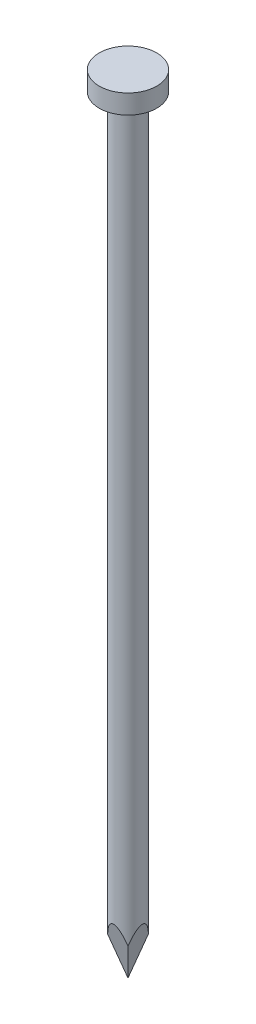
ISO-10303-21;
HEADER;
FILE_DESCRIPTION(('STEP AP214'),'2;1');
FILE_NAME('part.step','',(''),(''),'','','');
FILE_SCHEMA(('AUTOMOTIVE_DESIGN { 1 0 10303 214 1 1 1 1 }'));
ENDSEC;
DATA;
#1=APPLICATION_CONTEXT('core data for automotive mechanical design processes');
#2=APPLICATION_PROTOCOL_DEFINITION('international standard','automotive_design',2000,#1);
#3=PRODUCT_CONTEXT('',#1,'mechanical');
#4=PRODUCT('Part','Part','',(#3));
#5=PRODUCT_RELATED_PRODUCT_CATEGORY('part','',(#4));
#6=PRODUCT_DEFINITION_FORMATION('','',#4);
#7=PRODUCT_DEFINITION_CONTEXT('part definition',#1,'design');
#8=PRODUCT_DEFINITION('design','',#6,#7);
#9=PRODUCT_DEFINITION_SHAPE('','',#8);
#10=(LENGTH_UNIT() NAMED_UNIT(*) SI_UNIT(.MILLI.,.METRE.));
#11=(NAMED_UNIT(*) PLANE_ANGLE_UNIT() SI_UNIT($,.RADIAN.));
#12=(NAMED_UNIT(*) SI_UNIT($,.STERADIAN.) SOLID_ANGLE_UNIT());
#13=UNCERTAINTY_MEASURE_WITH_UNIT(LENGTH_MEASURE(1.E-05),#10,'distance_accuracy_value','');
#14=(GEOMETRIC_REPRESENTATION_CONTEXT(3) GLOBAL_UNCERTAINTY_ASSIGNED_CONTEXT((#13)) GLOBAL_UNIT_ASSIGNED_CONTEXT((#10,
#11,#12)) REPRESENTATION_CONTEXT('',''));
#15=CARTESIAN_POINT('',(0.,0.,0.));
#16=DIRECTION('',(0.,0.,1.));
#17=DIRECTION('',(1.,0.,0.));
#18=AXIS2_PLACEMENT_3D('',#15,#16,#17);
#19=CARTESIAN_POINT('',(0.,-40.,0.));
#20=DIRECTION('',(0.,1.,0.));
#21=DIRECTION('',(0.,0.,1.));
#22=AXIS2_PLACEMENT_3D('',#19,#20,#21);
#23=CYLINDRICAL_SURFACE('',#22,0.750000000000001);
#24=CARTESIAN_POINT('',(0.,-40.,0.));
#25=DIRECTION('',(0.965925826289067,0.258819045102525,0.));
#26=DIRECTION('',(-0.258819045102525,0.965925826289067,0.));
#27=AXIS2_PLACEMENT_3D('',#24,#25,#26);
#28=ELLIPSE('',#27,2.89777747886716,0.750000000000001);
#29=CARTESIAN_POINT('',(-0.530330085889911,-38.0207811746765,0.53033008588991));
#30=VERTEX_POINT('',#29);
#31=CARTESIAN_POINT('',(-0.530330085889905,-38.0207811746765,-0.530330085889918));
#32=VERTEX_POINT('',#31);
#33=EDGE_CURVE('E79',#30,#32,#28,.F.);
#34=ORIENTED_EDGE('',*,*,#33,.F.);
#35=CARTESIAN_POINT('',(0.,-40.,0.));
#36=DIRECTION('',(0.,0.258819045102525,-0.965925826289067));
#37=DIRECTION('',(0.,0.965925826289067,0.258819045102525));
#38=AXIS2_PLACEMENT_3D('',#35,#36,#37);
#39=ELLIPSE('',#38,2.89777747886716,0.750000000000001);
#40=CARTESIAN_POINT('',(0.530330085889917,-38.0207811746765,0.530330085889905));
#41=VERTEX_POINT('',#40);
#42=EDGE_CURVE('E76',#41,#30,#39,.F.);
#43=ORIENTED_EDGE('',*,*,#42,.F.);
#44=CARTESIAN_POINT('',(0.,-40.,0.));
#45=DIRECTION('',(-0.965925826289066,0.258819045102531,0.));
#46=DIRECTION('',(0.258819045102531,0.965925826289066,0.));
#47=AXIS2_PLACEMENT_3D('',#44,#45,#46);
#48=ELLIPSE('',#47,2.8977774788671,0.750000000000001);
#49=CARTESIAN_POINT('',(0.530330085889911,-38.0207811746766,-0.530330085889911));
#50=VERTEX_POINT('',#49);
#51=EDGE_CURVE('E64',#50,#41,#48,.F.);
#52=ORIENTED_EDGE('',*,*,#51,.F.);
#53=CARTESIAN_POINT('',(0.,-40.,0.));
#54=DIRECTION('',(0.,0.258819045102531,0.965925826289065));
#55=DIRECTION('',(0.,0.965925826289066,-0.258819045102531));
#56=AXIS2_PLACEMENT_3D('',#53,#54,#55);
#57=ELLIPSE('',#56,2.89777747886709,0.750000000000001);
#58=EDGE_CURVE('E74',#32,#50,#57,.F.);
#59=ORIENTED_EDGE('',*,*,#58,.F.);
#60=EDGE_LOOP('',(#34,#43,#52,#59));
#61=FACE_BOUND('',#60,.T.);
#62=CARTESIAN_POINT('',(0.,0.,0.));
#63=DIRECTION('',(0.,1.,0.));
#64=DIRECTION('',(0.,0.,1.));
#65=AXIS2_PLACEMENT_3D('',#62,#63,#64);
#66=CIRCLE('',#65,0.750000000000001);
#67=CARTESIAN_POINT('',(0.,0.,0.750000000000001));
#68=VERTEX_POINT('',#67);
#69=EDGE_CURVE('E69',#68,#68,#66,.T.);
#70=ORIENTED_EDGE('',*,*,#69,.F.);
#71=EDGE_LOOP('',(#70));
#72=FACE_BOUND('',#71,.T.);
#73=ADVANCED_FACE('F35',(#61,#72),#23,.T.);
#74=CARTESIAN_POINT('',(0.,1.,0.));
#75=DIRECTION('',(0.,-1.,0.));
#76=DIRECTION('',(0.,0.,-1.));
#77=AXIS2_PLACEMENT_3D('',#74,#75,#76);
#78=CYLINDRICAL_SURFACE('',#77,1.5);
#79=CARTESIAN_POINT('',(0.,1.,0.));
#80=DIRECTION('',(0.,1.,0.));
#81=DIRECTION('',(0.,0.,1.));
#82=AXIS2_PLACEMENT_3D('',#79,#80,#81);
#83=CIRCLE('',#82,1.5);
#84=CARTESIAN_POINT('',(0.,1.,1.5));
#85=VERTEX_POINT('',#84);
#86=EDGE_CURVE('E86',#85,#85,#83,.T.);
#87=ORIENTED_EDGE('',*,*,#86,.F.);
#88=EDGE_LOOP('',(#87));
#89=FACE_BOUND('',#88,.T.);
#90=CARTESIAN_POINT('',(0.,0.,0.));
#91=DIRECTION('',(0.,1.,0.));
#92=DIRECTION('',(0.,0.,1.));
#93=AXIS2_PLACEMENT_3D('',#90,#91,#92);
#94=CIRCLE('',#93,1.5);
#95=CARTESIAN_POINT('',(0.,0.,1.5));
#96=VERTEX_POINT('',#95);
#97=EDGE_CURVE('E81',#96,#96,#94,.T.);
#98=ORIENTED_EDGE('',*,*,#97,.T.);
#99=EDGE_LOOP('',(#98));
#100=FACE_BOUND('',#99,.T.);
#101=ADVANCED_FACE('F97',(#89,#100),#78,.T.);
#102=CARTESIAN_POINT('',(0.,1.,0.));
#103=DIRECTION('',(0.,1.,0.));
#104=DIRECTION('',(0.,0.,1.));
#105=AXIS2_PLACEMENT_3D('',#102,#103,#104);
#106=PLANE('',#105);
#107=ORIENTED_EDGE('',*,*,#86,.T.);
#108=EDGE_LOOP('',(#107));
#109=FACE_BOUND('',#108,.T.);
#110=ADVANCED_FACE('F101',(#109),#106,.T.);
#111=CARTESIAN_POINT('',(0.,0.,0.));
#112=DIRECTION('',(0.,1.,0.));
#113=DIRECTION('',(0.,0.,1.));
#114=AXIS2_PLACEMENT_3D('',#111,#112,#113);
#115=PLANE('',#114);
#116=ORIENTED_EDGE('',*,*,#69,.T.);
#117=EDGE_LOOP('',(#116));
#118=FACE_BOUND('',#117,.T.);
#119=ORIENTED_EDGE('',*,*,#97,.F.);
#120=EDGE_LOOP('',(#119));
#121=FACE_BOUND('',#120,.T.);
#122=ADVANCED_FACE('F94',(#118,#121),#115,.F.);
#123=CARTESIAN_POINT('',(-1.5,-40.,0.));
#124=DIRECTION('',(0.,0.258819045102525,-0.965925826289067));
#125=DIRECTION('',(0.,0.965925826289067,0.258819045102525));
#126=AXIS2_PLACEMENT_3D('',#123,#124,#125);
#127=PLANE('',#126);
#128=ORIENTED_EDGE('',*,*,#42,.T.);
#129=DIRECTION('',(0.250562807085735,-0.935113126531027,-0.250562807085735));
#130=VECTOR('',#129,1.);
#131=CARTESIAN_POINT('',(-0.0941725804420254,-39.6485431451105,0.0941725804420251));
#132=LINE('',#131,#130);
#133=CARTESIAN_POINT('',(0.,-40.,0.));
#134=VERTEX_POINT('',#133);
#135=EDGE_CURVE('E51',#30,#134,#132,.T.);
#136=ORIENTED_EDGE('',*,*,#135,.T.);
#137=DIRECTION('',(0.250562807085741,0.935113126531026,0.250562807085735));
#138=VECTOR('',#137,1.);
#139=CARTESIAN_POINT('',(-0.0941725804420295,-40.3514568548895,-0.094172580442027));
#140=LINE('',#139,#138);
#141=EDGE_CURVE('E66',#134,#41,#140,.T.);
#142=ORIENTED_EDGE('',*,*,#141,.T.);
#143=EDGE_LOOP('',(#128,#136,#142));
#144=FACE_BOUND('',#143,.T.);
#145=ADVANCED_FACE('F112',(#144),#127,.F.);
#146=CARTESIAN_POINT('',(-1.5,-35.516617783783,-1.20131864419545));
#147=DIRECTION('',(0.,0.258819045102531,0.965925826289065));
#148=DIRECTION('',(0.,-0.965925826289066,0.258819045102531));
#149=AXIS2_PLACEMENT_3D('',#146,#147,#148);
#150=PLANE('',#149);
#151=DIRECTION('',(-0.250562807085741,-0.935113126531024,0.250562807085741));
#152=VECTOR('',#151,1.);
#153=CARTESIAN_POINT('',(1.03172521264875,-36.1495490869452,-1.03172521264875));
#154=LINE('',#153,#152);
#155=EDGE_CURVE('E42',#50,#134,#154,.T.);
#156=ORIENTED_EDGE('',*,*,#155,.T.);
#157=DIRECTION('',(-0.250562807085735,0.935113126531026,-0.250562807085741));
#158=VECTOR('',#157,1.);
#159=CARTESIAN_POINT('',(-1.22007037353278,-35.4466353771662,-1.22007037353281));
#160=LINE('',#159,#158);
#161=EDGE_CURVE('E11',#134,#32,#160,.T.);
#162=ORIENTED_EDGE('',*,*,#161,.T.);
#163=ORIENTED_EDGE('',*,*,#58,.T.);
#164=EDGE_LOOP('',(#156,#162,#163));
#165=FACE_BOUND('',#164,.T.);
#166=ADVANCED_FACE('F78',(#165),#150,.F.);
#167=CARTESIAN_POINT('',(1.26751187810826,-35.2695812717031,-1.5));
#168=DIRECTION('',(-0.965925826289066,0.258819045102531,0.));
#169=DIRECTION('',(-0.258819045102531,-0.965925826289066,0.));
#170=AXIS2_PLACEMENT_3D('',#167,#168,#169);
#171=PLANE('',#170);
#172=ORIENTED_EDGE('',*,*,#51,.T.);
#173=ORIENTED_EDGE('',*,*,#141,.F.);
#174=ORIENTED_EDGE('',*,*,#155,.F.);
#175=EDGE_LOOP('',(#172,#173,#174));
#176=FACE_BOUND('',#175,.T.);
#177=ADVANCED_FACE('F63',(#176),#171,.F.);
#178=CARTESIAN_POINT('',(0.,-40.,-1.5));
#179=DIRECTION('',(0.965925826289067,0.258819045102525,0.));
#180=DIRECTION('',(-0.258819045102525,0.965925826289067,0.));
#181=AXIS2_PLACEMENT_3D('',#178,#179,#180);
#182=PLANE('',#181);
#183=ORIENTED_EDGE('',*,*,#33,.T.);
#184=ORIENTED_EDGE('',*,*,#161,.F.);
#185=ORIENTED_EDGE('',*,*,#135,.F.);
#186=EDGE_LOOP('',(#183,#184,#185));
#187=FACE_BOUND('',#186,.T.);
#188=ADVANCED_FACE('F119',(#187),#182,.F.);
#189=CLOSED_SHELL('',(#73,#101,#110,#122,#145,#166,#177,#188));
#190=MANIFOLD_SOLID_BREP('B2',#189);
#191=ADVANCED_BREP_SHAPE_REPRESENTATION('',(#18,#190),#14);
#192=SHAPE_DEFINITION_REPRESENTATION(#9,#191);
ENDSEC;
END-ISO-10303-21;
